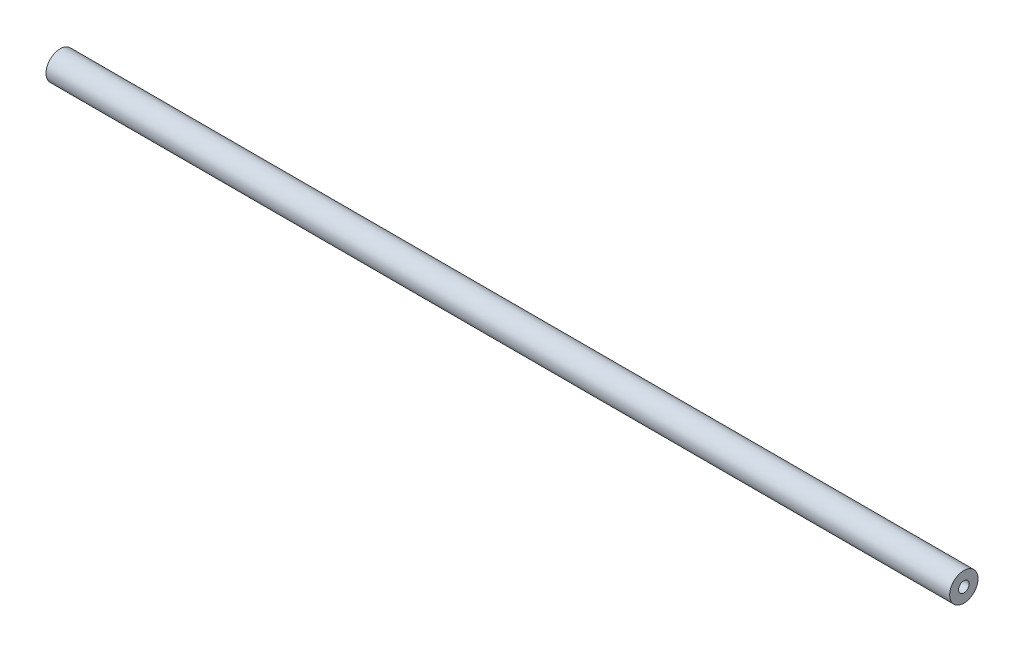
ISO-10303-21;
HEADER;
FILE_DESCRIPTION(('STEP AP214'),'2;1');
FILE_NAME('part.step','',(''),(''),'','','');
FILE_SCHEMA(('AUTOMOTIVE_DESIGN { 1 0 10303 214 1 1 1 1 }'));
ENDSEC;
DATA;
#1=APPLICATION_CONTEXT('core data for automotive mechanical design processes');
#2=APPLICATION_PROTOCOL_DEFINITION('international standard','automotive_design',2000,#1);
#3=PRODUCT_CONTEXT('',#1,'mechanical');
#4=PRODUCT('Part','Part','',(#3));
#5=PRODUCT_RELATED_PRODUCT_CATEGORY('part','',(#4));
#6=PRODUCT_DEFINITION_FORMATION('','',#4);
#7=PRODUCT_DEFINITION_CONTEXT('part definition',#1,'design');
#8=PRODUCT_DEFINITION('design','',#6,#7);
#9=PRODUCT_DEFINITION_SHAPE('','',#8);
#10=(LENGTH_UNIT() NAMED_UNIT(*) SI_UNIT(.MILLI.,.METRE.));
#11=(NAMED_UNIT(*) PLANE_ANGLE_UNIT() SI_UNIT($,.RADIAN.));
#12=(NAMED_UNIT(*) SI_UNIT($,.STERADIAN.) SOLID_ANGLE_UNIT());
#13=UNCERTAINTY_MEASURE_WITH_UNIT(LENGTH_MEASURE(1.E-05),#10,'distance_accuracy_value','');
#14=(GEOMETRIC_REPRESENTATION_CONTEXT(3) GLOBAL_UNCERTAINTY_ASSIGNED_CONTEXT((#13)) GLOBAL_UNIT_ASSIGNED_CONTEXT((#10,
#11,#12)) REPRESENTATION_CONTEXT('',''));
#15=CARTESIAN_POINT('',(0.,0.,0.));
#16=DIRECTION('',(0.,0.,1.));
#17=DIRECTION('',(1.,0.,0.));
#18=AXIS2_PLACEMENT_3D('',#15,#16,#17);
#19=CARTESIAN_POINT('',(233.000000000061,0.,0.));
#20=DIRECTION('',(1.,0.,0.));
#21=DIRECTION('',(0.,0.,-1.));
#22=AXIS2_PLACEMENT_3D('',#19,#20,#21);
#23=CONICAL_SURFACE('',#22,2.49999999999773,1.0297442586719);
#24=CARTESIAN_POINT('',(231.497848452477,0.,0.));
#25=VERTEX_POINT('',#24);
#26=VERTEX_LOOP('',#25);
#27=FACE_BOUND('',#26,.T.);
#28=CARTESIAN_POINT('',(233.,0.,0.));
#29=DIRECTION('',(1.,0.,0.));
#30=DIRECTION('',(0.,0.,-1.));
#31=AXIS2_PLACEMENT_3D('',#28,#29,#30);
#32=CIRCLE('',#31,2.5);
#33=CARTESIAN_POINT('',(233.,0.,-2.5));
#34=VERTEX_POINT('',#33);
#35=EDGE_CURVE('E37',#34,#34,#32,.T.);
#36=ORIENTED_EDGE('',*,*,#35,.T.);
#37=EDGE_LOOP('',(#36));
#38=FACE_BOUND('',#37,.T.);
#39=ADVANCED_FACE('F17',(#27,#38),#23,.F.);
#40=CARTESIAN_POINT('',(-232.999999999947,0.,0.));
#41=DIRECTION('',(-1.,0.,0.));
#42=DIRECTION('',(0.,0.,1.));
#43=AXIS2_PLACEMENT_3D('',#40,#41,#42);
#44=CONICAL_SURFACE('',#43,2.49999999994088,1.02974425867857);
#45=CARTESIAN_POINT('',(-231.49784845242,0.,0.));
#46=VERTEX_POINT('',#45);
#47=VERTEX_LOOP('',#46);
#48=FACE_BOUND('',#47,.T.);
#49=CARTESIAN_POINT('',(-233.,0.,0.));
#50=DIRECTION('',(-1.,0.,0.));
#51=DIRECTION('',(0.,0.,1.));
#52=AXIS2_PLACEMENT_3D('',#49,#50,#51);
#53=CIRCLE('',#52,2.5);
#54=CARTESIAN_POINT('',(-233.,0.,2.5));
#55=VERTEX_POINT('',#54);
#56=EDGE_CURVE('E39',#55,#55,#53,.T.);
#57=ORIENTED_EDGE('',*,*,#56,.T.);
#58=EDGE_LOOP('',(#57));
#59=FACE_BOUND('',#58,.T.);
#60=ADVANCED_FACE('F34',(#48,#59),#44,.F.);
#61=CARTESIAN_POINT('',(255.,0.,0.));
#62=DIRECTION('',(1.,0.,0.));
#63=DIRECTION('',(0.,0.,-1.));
#64=AXIS2_PLACEMENT_3D('',#61,#62,#63);
#65=CYLINDRICAL_SURFACE('',#64,2.5);
#66=ORIENTED_EDGE('',*,*,#35,.F.);
#67=EDGE_LOOP('',(#66));
#68=FACE_BOUND('',#67,.T.);
#69=CARTESIAN_POINT('',(237.,0.,0.));
#70=DIRECTION('',(1.,0.,0.));
#71=DIRECTION('',(0.,0.,-1.));
#72=AXIS2_PLACEMENT_3D('',#69,#70,#71);
#73=CIRCLE('',#72,2.5);
#74=CARTESIAN_POINT('',(237.,0.,-2.5));
#75=VERTEX_POINT('',#74);
#76=EDGE_CURVE('E20',#75,#75,#73,.T.);
#77=ORIENTED_EDGE('',*,*,#76,.T.);
#78=EDGE_LOOP('',(#77));
#79=FACE_BOUND('',#78,.T.);
#80=ADVANCED_FACE('F64',(#68,#79),#65,.F.);
#81=CARTESIAN_POINT('',(-255.,0.,0.));
#82=DIRECTION('',(-1.,0.,0.));
#83=DIRECTION('',(0.,0.,1.));
#84=AXIS2_PLACEMENT_3D('',#81,#82,#83);
#85=CYLINDRICAL_SURFACE('',#84,2.5);
#86=ORIENTED_EDGE('',*,*,#56,.F.);
#87=EDGE_LOOP('',(#86));
#88=FACE_BOUND('',#87,.T.);
#89=CARTESIAN_POINT('',(-237.,0.,0.));
#90=DIRECTION('',(-1.,0.,0.));
#91=DIRECTION('',(0.,0.,1.));
#92=AXIS2_PLACEMENT_3D('',#89,#90,#91);
#93=CIRCLE('',#92,2.5);
#94=CARTESIAN_POINT('',(-237.,0.,2.5));
#95=VERTEX_POINT('',#94);
#96=EDGE_CURVE('E57',#95,#95,#93,.T.);
#97=ORIENTED_EDGE('',*,*,#96,.T.);
#98=EDGE_LOOP('',(#97));
#99=FACE_BOUND('',#98,.T.);
#100=ADVANCED_FACE('F69',(#88,#99),#85,.F.);
#101=CARTESIAN_POINT('',(237.,2.5,0.));
#102=DIRECTION('',(-1.,0.,0.));
#103=DIRECTION('',(0.,0.,1.));
#104=AXIS2_PLACEMENT_3D('',#101,#102,#103);
#105=PLANE('',#104);
#106=CARTESIAN_POINT('',(237.,0.,0.));
#107=DIRECTION('',(1.,0.,0.));
#108=DIRECTION('',(0.,0.,-1.));
#109=AXIS2_PLACEMENT_3D('',#106,#107,#108);
#110=CIRCLE('',#109,3.);
#111=CARTESIAN_POINT('',(237.,0.,-3.));
#112=VERTEX_POINT('',#111);
#113=EDGE_CURVE('E55',#112,#112,#110,.T.);
#114=ORIENTED_EDGE('',*,*,#113,.T.);
#115=EDGE_LOOP('',(#114));
#116=FACE_BOUND('',#115,.T.);
#117=ORIENTED_EDGE('',*,*,#76,.F.);
#118=EDGE_LOOP('',(#117));
#119=FACE_BOUND('',#118,.T.);
#120=ADVANCED_FACE('F66',(#116,#119),#105,.F.);
#121=CARTESIAN_POINT('',(-237.,2.5,0.));
#122=DIRECTION('',(1.,0.,0.));
#123=DIRECTION('',(0.,0.,-1.));
#124=AXIS2_PLACEMENT_3D('',#121,#122,#123);
#125=PLANE('',#124);
#126=CARTESIAN_POINT('',(-237.,0.,0.));
#127=DIRECTION('',(-1.,0.,0.));
#128=DIRECTION('',(0.,0.,1.));
#129=AXIS2_PLACEMENT_3D('',#126,#127,#128);
#130=CIRCLE('',#129,3.);
#131=CARTESIAN_POINT('',(-237.,0.,3.));
#132=VERTEX_POINT('',#131);
#133=EDGE_CURVE('E52',#132,#132,#130,.T.);
#134=ORIENTED_EDGE('',*,*,#133,.T.);
#135=EDGE_LOOP('',(#134));
#136=FACE_BOUND('',#135,.T.);
#137=ORIENTED_EDGE('',*,*,#96,.F.);
#138=EDGE_LOOP('',(#137));
#139=FACE_BOUND('',#138,.T.);
#140=ADVANCED_FACE('F68',(#136,#139),#125,.F.);
#141=CARTESIAN_POINT('',(255.,0.,0.));
#142=DIRECTION('',(1.,0.,0.));
#143=DIRECTION('',(0.,0.,-1.));
#144=AXIS2_PLACEMENT_3D('',#141,#142,#143);
#145=CYLINDRICAL_SURFACE('',#144,3.);
#146=CARTESIAN_POINT('',(255.,0.,0.));
#147=DIRECTION('',(1.,0.,0.));
#148=DIRECTION('',(0.,0.,-1.));
#149=AXIS2_PLACEMENT_3D('',#146,#147,#148);
#150=CIRCLE('',#149,3.);
#151=CARTESIAN_POINT('',(255.,0.,-3.));
#152=VERTEX_POINT('',#151);
#153=EDGE_CURVE('E49',#152,#152,#150,.F.);
#154=ORIENTED_EDGE('',*,*,#153,.F.);
#155=EDGE_LOOP('',(#154));
#156=FACE_BOUND('',#155,.T.);
#157=ORIENTED_EDGE('',*,*,#113,.F.);
#158=EDGE_LOOP('',(#157));
#159=FACE_BOUND('',#158,.T.);
#160=ADVANCED_FACE('F77',(#156,#159),#145,.F.);
#161=CARTESIAN_POINT('',(-255.,0.,0.));
#162=DIRECTION('',(-1.,0.,0.));
#163=DIRECTION('',(0.,0.,1.));
#164=AXIS2_PLACEMENT_3D('',#161,#162,#163);
#165=CYLINDRICAL_SURFACE('',#164,3.);
#166=ORIENTED_EDGE('',*,*,#133,.F.);
#167=EDGE_LOOP('',(#166));
#168=FACE_BOUND('',#167,.T.);
#169=CARTESIAN_POINT('',(-255.,0.,0.));
#170=DIRECTION('',(-1.,0.,0.));
#171=DIRECTION('',(0.,0.,1.));
#172=AXIS2_PLACEMENT_3D('',#169,#170,#171);
#173=CIRCLE('',#172,3.);
#174=CARTESIAN_POINT('',(-255.,0.,3.));
#175=VERTEX_POINT('',#174);
#176=EDGE_CURVE('E46',#175,#175,#173,.T.);
#177=ORIENTED_EDGE('',*,*,#176,.T.);
#178=EDGE_LOOP('',(#177));
#179=FACE_BOUND('',#178,.T.);
#180=ADVANCED_FACE('F97',(#168,#179),#165,.F.);
#181=CARTESIAN_POINT('',(255.,0.,0.));
#182=DIRECTION('',(1.,0.,0.));
#183=DIRECTION('',(0.,0.,-1.));
#184=AXIS2_PLACEMENT_3D('',#181,#182,#183);
#185=PLANE('',#184);
#186=CARTESIAN_POINT('',(255.,0.,0.));
#187=DIRECTION('',(-1.,0.,0.));
#188=DIRECTION('',(0.,0.,1.));
#189=AXIS2_PLACEMENT_3D('',#186,#187,#188);
#190=CIRCLE('',#189,8.);
#191=CARTESIAN_POINT('',(255.,0.,8.));
#192=VERTEX_POINT('',#191);
#193=EDGE_CURVE('E26',#192,#192,#190,.T.);
#194=ORIENTED_EDGE('',*,*,#193,.F.);
#195=EDGE_LOOP('',(#194));
#196=FACE_BOUND('',#195,.T.);
#197=ORIENTED_EDGE('',*,*,#153,.T.);
#198=EDGE_LOOP('',(#197));
#199=FACE_BOUND('',#198,.T.);
#200=ADVANCED_FACE('F90',(#196,#199),#185,.T.);
#201=CARTESIAN_POINT('',(-255.,0.,0.));
#202=DIRECTION('',(1.,0.,0.));
#203=DIRECTION('',(0.,0.,-1.));
#204=AXIS2_PLACEMENT_3D('',#201,#202,#203);
#205=PLANE('',#204);
#206=CARTESIAN_POINT('',(-255.,0.,0.));
#207=DIRECTION('',(-1.,0.,0.));
#208=DIRECTION('',(0.,0.,1.));
#209=AXIS2_PLACEMENT_3D('',#206,#207,#208);
#210=CIRCLE('',#209,8.);
#211=CARTESIAN_POINT('',(-255.,0.,8.));
#212=VERTEX_POINT('',#211);
#213=EDGE_CURVE('E11',#212,#212,#210,.F.);
#214=ORIENTED_EDGE('',*,*,#213,.F.);
#215=EDGE_LOOP('',(#214));
#216=FACE_BOUND('',#215,.T.);
#217=ORIENTED_EDGE('',*,*,#176,.F.);
#218=EDGE_LOOP('',(#217));
#219=FACE_BOUND('',#218,.T.);
#220=ADVANCED_FACE('F84',(#216,#219),#205,.F.);
#221=CARTESIAN_POINT('',(255.,0.,0.));
#222=DIRECTION('',(-1.,0.,0.));
#223=DIRECTION('',(0.,0.,1.));
#224=AXIS2_PLACEMENT_3D('',#221,#222,#223);
#225=CYLINDRICAL_SURFACE('',#224,8.);
#226=ORIENTED_EDGE('',*,*,#213,.T.);
#227=EDGE_LOOP('',(#226));
#228=FACE_BOUND('',#227,.T.);
#229=ORIENTED_EDGE('',*,*,#193,.T.);
#230=EDGE_LOOP('',(#229));
#231=FACE_BOUND('',#230,.T.);
#232=ADVANCED_FACE('F82',(#228,#231),#225,.T.);
#233=CLOSED_SHELL('',(#39,#60,#80,#100,#120,#140,#160,#180,#200,#220,#232));
#234=MANIFOLD_SOLID_BREP('B1',#233);
#235=ADVANCED_BREP_SHAPE_REPRESENTATION('',(#18,#234),#14);
#236=SHAPE_DEFINITION_REPRESENTATION(#9,#235);
ENDSEC;
END-ISO-10303-21;
